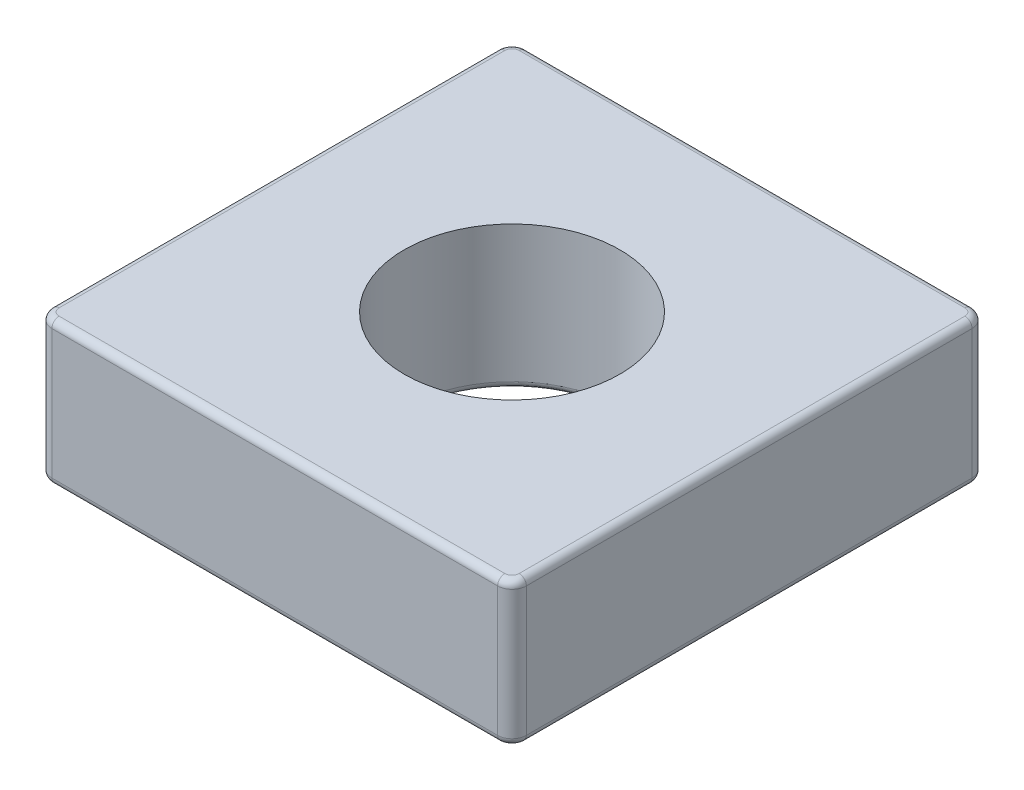
ISO-10303-21;
HEADER;
FILE_DESCRIPTION(('STEP AP214'),'2;1');
FILE_NAME('part.step','',(''),(''),'','','');
FILE_SCHEMA(('AUTOMOTIVE_DESIGN { 1 0 10303 214 1 1 1 1 }'));
ENDSEC;
DATA;
#1=APPLICATION_CONTEXT('core data for automotive mechanical design processes');
#2=APPLICATION_PROTOCOL_DEFINITION('international standard','automotive_design',2000,#1);
#3=PRODUCT_CONTEXT('',#1,'mechanical');
#4=PRODUCT('Part','Part','',(#3));
#5=PRODUCT_RELATED_PRODUCT_CATEGORY('part','',(#4));
#6=PRODUCT_DEFINITION_FORMATION('','',#4);
#7=PRODUCT_DEFINITION_CONTEXT('part definition',#1,'design');
#8=PRODUCT_DEFINITION('design','',#6,#7);
#9=PRODUCT_DEFINITION_SHAPE('','',#8);
#10=(LENGTH_UNIT() NAMED_UNIT(*) SI_UNIT(.MILLI.,.METRE.));
#11=(NAMED_UNIT(*) PLANE_ANGLE_UNIT() SI_UNIT($,.RADIAN.));
#12=(NAMED_UNIT(*) SI_UNIT($,.STERADIAN.) SOLID_ANGLE_UNIT());
#13=UNCERTAINTY_MEASURE_WITH_UNIT(LENGTH_MEASURE(1.E-05),#10,'distance_accuracy_value','');
#14=(GEOMETRIC_REPRESENTATION_CONTEXT(3) GLOBAL_UNCERTAINTY_ASSIGNED_CONTEXT((#13)) GLOBAL_UNIT_ASSIGNED_CONTEXT((#10,
#11,#12)) REPRESENTATION_CONTEXT('',''));
#15=CARTESIAN_POINT('',(0.,0.,0.));
#16=DIRECTION('',(0.,0.,1.));
#17=DIRECTION('',(1.,0.,0.));
#18=AXIS2_PLACEMENT_3D('',#15,#16,#17);
#19=CARTESIAN_POINT('',(-3.3,2.,-3.3));
#20=DIRECTION('',(1.,0.,0.));
#21=DIRECTION('',(0.,0.,-1.));
#22=AXIS2_PLACEMENT_3D('',#19,#20,#21);
#23=PLANE('',#22);
#24=DIRECTION('',(0.,-1.,0.));
#25=VECTOR('',#24,1.);
#26=CARTESIAN_POINT('',(-3.3,2.,3.1));
#27=LINE('',#26,#25);
#28=CARTESIAN_POINT('',(-3.3,0.1,3.1));
#29=VERTEX_POINT('',#28);
#30=CARTESIAN_POINT('',(-3.3,1.9,3.1));
#31=VERTEX_POINT('',#30);
#32=EDGE_CURVE('E303',#29,#31,#27,.F.);
#33=ORIENTED_EDGE('',*,*,#32,.T.);
#34=DIRECTION('',(0.,0.,1.));
#35=VECTOR('',#34,1.);
#36=CARTESIAN_POINT('',(-3.3,1.9,-3.1));
#37=LINE('',#36,#35);
#38=CARTESIAN_POINT('',(-3.3,1.9,-3.1));
#39=VERTEX_POINT('',#38);
#40=EDGE_CURVE('E191',#31,#39,#37,.F.);
#41=ORIENTED_EDGE('',*,*,#40,.T.);
#42=DIRECTION('',(0.,-1.,0.));
#43=VECTOR('',#42,1.);
#44=CARTESIAN_POINT('',(-3.3,2.,-3.1));
#45=LINE('',#44,#43);
#46=CARTESIAN_POINT('',(-3.3,0.1,-3.1));
#47=VERTEX_POINT('',#46);
#48=EDGE_CURVE('E298',#39,#47,#45,.T.);
#49=ORIENTED_EDGE('',*,*,#48,.T.);
#50=DIRECTION('',(0.,0.,1.));
#51=VECTOR('',#50,1.);
#52=CARTESIAN_POINT('',(-3.3,0.1,-3.3));
#53=LINE('',#52,#51);
#54=EDGE_CURVE('E189',#47,#29,#53,.T.);
#55=ORIENTED_EDGE('',*,*,#54,.T.);
#56=EDGE_LOOP('',(#33,#41,#49,#55));
#57=FACE_BOUND('',#56,.T.);
#58=ADVANCED_FACE('F38',(#57),#23,.F.);
#59=CARTESIAN_POINT('',(-3.3,2.,3.3));
#60=DIRECTION('',(0.,0.,-1.));
#61=DIRECTION('',(-1.,0.,0.));
#62=AXIS2_PLACEMENT_3D('',#59,#60,#61);
#63=PLANE('',#62);
#64=DIRECTION('',(0.,-1.,0.));
#65=VECTOR('',#64,1.);
#66=CARTESIAN_POINT('',(-3.1,2.,3.3));
#67=LINE('',#66,#65);
#68=CARTESIAN_POINT('',(-3.1,1.9,3.3));
#69=VERTEX_POINT('',#68);
#70=CARTESIAN_POINT('',(-3.1,0.1,3.3));
#71=VERTEX_POINT('',#70);
#72=EDGE_CURVE('E310',#69,#71,#67,.T.);
#73=ORIENTED_EDGE('',*,*,#72,.T.);
#74=DIRECTION('',(1.,0.,0.));
#75=VECTOR('',#74,1.);
#76=CARTESIAN_POINT('',(-3.3,0.1,3.3));
#77=LINE('',#76,#75);
#78=CARTESIAN_POINT('',(3.1,0.1,3.3));
#79=VERTEX_POINT('',#78);
#80=EDGE_CURVE('E47',#71,#79,#77,.T.);
#81=ORIENTED_EDGE('',*,*,#80,.T.);
#82=DIRECTION('',(0.,-1.,0.));
#83=VECTOR('',#82,1.);
#84=CARTESIAN_POINT('',(3.1,2.,3.3));
#85=LINE('',#84,#83);
#86=CARTESIAN_POINT('',(3.1,1.9,3.3));
#87=VERTEX_POINT('',#86);
#88=EDGE_CURVE('E173',#79,#87,#85,.F.);
#89=ORIENTED_EDGE('',*,*,#88,.T.);
#90=DIRECTION('',(1.,0.,0.));
#91=VECTOR('',#90,1.);
#92=CARTESIAN_POINT('',(-3.1,1.9,3.3));
#93=LINE('',#92,#91);
#94=EDGE_CURVE('E230',#87,#69,#93,.F.);
#95=ORIENTED_EDGE('',*,*,#94,.T.);
#96=EDGE_LOOP('',(#73,#81,#89,#95));
#97=FACE_BOUND('',#96,.T.);
#98=ADVANCED_FACE('F357',(#97),#63,.F.);
#99=CARTESIAN_POINT('',(3.3,2.,-3.3));
#100=DIRECTION('',(-1.,0.,0.));
#101=DIRECTION('',(0.,0.,1.));
#102=AXIS2_PLACEMENT_3D('',#99,#100,#101);
#103=PLANE('',#102);
#104=DIRECTION('',(0.,-1.,0.));
#105=VECTOR('',#104,1.);
#106=CARTESIAN_POINT('',(3.3,2.,-3.1));
#107=LINE('',#106,#105);
#108=CARTESIAN_POINT('',(3.3,0.1,-3.1));
#109=VERTEX_POINT('',#108);
#110=CARTESIAN_POINT('',(3.3,1.9,-3.1));
#111=VERTEX_POINT('',#110);
#112=EDGE_CURVE('E291',#109,#111,#107,.F.);
#113=ORIENTED_EDGE('',*,*,#112,.T.);
#114=DIRECTION('',(0.,0.,-1.));
#115=VECTOR('',#114,1.);
#116=CARTESIAN_POINT('',(3.3,1.9,3.1));
#117=LINE('',#116,#115);
#118=CARTESIAN_POINT('',(3.3,1.9,3.1));
#119=VERTEX_POINT('',#118);
#120=EDGE_CURVE('E207',#111,#119,#117,.F.);
#121=ORIENTED_EDGE('',*,*,#120,.T.);
#122=DIRECTION('',(0.,-1.,0.));
#123=VECTOR('',#122,1.);
#124=CARTESIAN_POINT('',(3.3,2.,3.1));
#125=LINE('',#124,#123);
#126=CARTESIAN_POINT('',(3.3,0.1,3.1));
#127=VERTEX_POINT('',#126);
#128=EDGE_CURVE('E300',#119,#127,#125,.T.);
#129=ORIENTED_EDGE('',*,*,#128,.T.);
#130=DIRECTION('',(0.,0.,-1.));
#131=VECTOR('',#130,1.);
#132=CARTESIAN_POINT('',(3.3,0.1,-3.3));
#133=LINE('',#132,#131);
#134=EDGE_CURVE('E205',#127,#109,#133,.T.);
#135=ORIENTED_EDGE('',*,*,#134,.T.);
#136=EDGE_LOOP('',(#113,#121,#129,#135));
#137=FACE_BOUND('',#136,.T.);
#138=ADVANCED_FACE('F353',(#137),#103,.F.);
#139=CARTESIAN_POINT('',(-3.3,2.,-3.3));
#140=DIRECTION('',(0.,0.,1.));
#141=DIRECTION('',(1.,0.,0.));
#142=AXIS2_PLACEMENT_3D('',#139,#140,#141);
#143=PLANE('',#142);
#144=DIRECTION('',(0.,-1.,0.));
#145=VECTOR('',#144,1.);
#146=CARTESIAN_POINT('',(-3.1,2.,-3.3));
#147=LINE('',#146,#145);
#148=CARTESIAN_POINT('',(-3.1,0.1,-3.3));
#149=VERTEX_POINT('',#148);
#150=CARTESIAN_POINT('',(-3.1,1.9,-3.3));
#151=VERTEX_POINT('',#150);
#152=EDGE_CURVE('E297',#149,#151,#147,.F.);
#153=ORIENTED_EDGE('',*,*,#152,.T.);
#154=DIRECTION('',(-1.,0.,0.));
#155=VECTOR('',#154,1.);
#156=CARTESIAN_POINT('',(3.1,1.9,-3.3));
#157=LINE('',#156,#155);
#158=CARTESIAN_POINT('',(3.1,1.9,-3.3));
#159=VERTEX_POINT('',#158);
#160=EDGE_CURVE('E199',#151,#159,#157,.F.);
#161=ORIENTED_EDGE('',*,*,#160,.T.);
#162=DIRECTION('',(0.,-1.,0.));
#163=VECTOR('',#162,1.);
#164=CARTESIAN_POINT('',(3.1,2.,-3.3));
#165=LINE('',#164,#163);
#166=CARTESIAN_POINT('',(3.1,0.1,-3.3));
#167=VERTEX_POINT('',#166);
#168=EDGE_CURVE('E288',#159,#167,#165,.T.);
#169=ORIENTED_EDGE('',*,*,#168,.T.);
#170=DIRECTION('',(-1.,0.,0.));
#171=VECTOR('',#170,1.);
#172=CARTESIAN_POINT('',(-3.3,0.1,-3.3));
#173=LINE('',#172,#171);
#174=EDGE_CURVE('E197',#167,#149,#173,.T.);
#175=ORIENTED_EDGE('',*,*,#174,.T.);
#176=EDGE_LOOP('',(#153,#161,#169,#175));
#177=FACE_BOUND('',#176,.T.);
#178=ADVANCED_FACE('F294',(#177),#143,.F.);
#179=CARTESIAN_POINT('',(0.,2.,0.));
#180=DIRECTION('',(0.,1.,0.));
#181=DIRECTION('',(0.,0.,1.));
#182=AXIS2_PLACEMENT_3D('',#179,#180,#181);
#183=PLANE('',#182);
#184=DIRECTION('',(0.,0.,1.));
#185=VECTOR('',#184,1.);
#186=CARTESIAN_POINT('',(-3.2,2.,3.1));
#187=LINE('',#186,#185);
#188=CARTESIAN_POINT('',(-3.2,2.,-3.1));
#189=VERTEX_POINT('',#188);
#190=CARTESIAN_POINT('',(-3.2,2.,3.1));
#191=VERTEX_POINT('',#190);
#192=EDGE_CURVE('E178',#189,#191,#187,.T.);
#193=ORIENTED_EDGE('',*,*,#192,.T.);
#194=CARTESIAN_POINT('',(-3.1,2.,3.1));
#195=DIRECTION('',(0.,1.,0.));
#196=DIRECTION('',(0.,0.,1.));
#197=AXIS2_PLACEMENT_3D('',#194,#195,#196);
#198=CIRCLE('',#197,0.1);
#199=CARTESIAN_POINT('',(-3.1,2.,3.2));
#200=VERTEX_POINT('',#199);
#201=EDGE_CURVE('E158',#191,#200,#198,.T.);
#202=ORIENTED_EDGE('',*,*,#201,.T.);
#203=DIRECTION('',(1.,0.,0.));
#204=VECTOR('',#203,1.);
#205=CARTESIAN_POINT('',(3.1,2.,3.2));
#206=LINE('',#205,#204);
#207=CARTESIAN_POINT('',(3.1,2.,3.2));
#208=VERTEX_POINT('',#207);
#209=EDGE_CURVE('E166',#200,#208,#206,.T.);
#210=ORIENTED_EDGE('',*,*,#209,.T.);
#211=CARTESIAN_POINT('',(3.1,2.,3.1));
#212=DIRECTION('',(0.,1.,0.));
#213=DIRECTION('',(0.,0.,1.));
#214=AXIS2_PLACEMENT_3D('',#211,#212,#213);
#215=CIRCLE('',#214,0.1);
#216=CARTESIAN_POINT('',(3.2,2.,3.1));
#217=VERTEX_POINT('',#216);
#218=EDGE_CURVE('E172',#208,#217,#215,.T.);
#219=ORIENTED_EDGE('',*,*,#218,.T.);
#220=DIRECTION('',(0.,0.,-1.));
#221=VECTOR('',#220,1.);
#222=CARTESIAN_POINT('',(3.2,2.,-3.1));
#223=LINE('',#222,#221);
#224=CARTESIAN_POINT('',(3.2,2.,-3.1));
#225=VERTEX_POINT('',#224);
#226=EDGE_CURVE('E316',#217,#225,#223,.T.);
#227=ORIENTED_EDGE('',*,*,#226,.T.);
#228=CARTESIAN_POINT('',(3.1,2.,-3.1));
#229=DIRECTION('',(0.,1.,0.));
#230=DIRECTION('',(0.,0.,1.));
#231=AXIS2_PLACEMENT_3D('',#228,#229,#230);
#232=CIRCLE('',#231,0.1);
#233=CARTESIAN_POINT('',(3.1,2.,-3.2));
#234=VERTEX_POINT('',#233);
#235=EDGE_CURVE('E318',#225,#234,#232,.T.);
#236=ORIENTED_EDGE('',*,*,#235,.T.);
#237=DIRECTION('',(-1.,0.,0.));
#238=VECTOR('',#237,1.);
#239=CARTESIAN_POINT('',(-3.1,2.,-3.2));
#240=LINE('',#239,#238);
#241=CARTESIAN_POINT('',(-3.1,2.,-3.2));
#242=VERTEX_POINT('',#241);
#243=EDGE_CURVE('E320',#234,#242,#240,.T.);
#244=ORIENTED_EDGE('',*,*,#243,.T.);
#245=CARTESIAN_POINT('',(-3.1,2.,-3.1));
#246=DIRECTION('',(0.,1.,0.));
#247=DIRECTION('',(0.,0.,1.));
#248=AXIS2_PLACEMENT_3D('',#245,#246,#247);
#249=CIRCLE('',#248,0.1);
#250=EDGE_CURVE('E184',#242,#189,#249,.T.);
#251=ORIENTED_EDGE('',*,*,#250,.T.);
#252=EDGE_LOOP('',(#193,#202,#210,#219,#227,#236,#244,#251));
#253=FACE_BOUND('',#252,.T.);
#254=CARTESIAN_POINT('',(0.,2.,0.));
#255=DIRECTION('',(0.,1.,0.));
#256=DIRECTION('',(0.,0.,1.));
#257=AXIS2_PLACEMENT_3D('',#254,#255,#256);
#258=CIRCLE('',#257,1.5);
#259=CARTESIAN_POINT('',(0.,2.,1.5));
#260=VERTEX_POINT('',#259);
#261=EDGE_CURVE('E250',#260,#260,#258,.T.);
#262=ORIENTED_EDGE('',*,*,#261,.F.);
#263=EDGE_LOOP('',(#262));
#264=FACE_BOUND('',#263,.T.);
#265=ADVANCED_FACE('F175',(#253,#264),#183,.T.);
#266=CARTESIAN_POINT('',(0.,0.,0.));
#267=DIRECTION('',(0.,1.,0.));
#268=DIRECTION('',(0.,0.,1.));
#269=AXIS2_PLACEMENT_3D('',#266,#267,#268);
#270=PLANE('',#269);
#271=DIRECTION('',(1.,0.,0.));
#272=VECTOR('',#271,1.);
#273=CARTESIAN_POINT('',(0.,0.,3.2));
#274=LINE('',#273,#272);
#275=CARTESIAN_POINT('',(3.1,0.,3.2));
#276=VERTEX_POINT('',#275);
#277=CARTESIAN_POINT('',(-3.1,0.,3.2));
#278=VERTEX_POINT('',#277);
#279=EDGE_CURVE('E55',#276,#278,#274,.F.);
#280=ORIENTED_EDGE('',*,*,#279,.T.);
#281=CARTESIAN_POINT('',(-3.1,0.,3.1));
#282=DIRECTION('',(0.,1.,0.));
#283=DIRECTION('',(0.,0.,1.));
#284=AXIS2_PLACEMENT_3D('',#281,#282,#283);
#285=CIRCLE('',#284,0.1);
#286=CARTESIAN_POINT('',(-3.2,0.,3.1));
#287=VERTEX_POINT('',#286);
#288=EDGE_CURVE('E228',#278,#287,#285,.F.);
#289=ORIENTED_EDGE('',*,*,#288,.T.);
#290=DIRECTION('',(0.,0.,1.));
#291=VECTOR('',#290,1.);
#292=CARTESIAN_POINT('',(-3.2,0.,0.));
#293=LINE('',#292,#291);
#294=CARTESIAN_POINT('',(-3.2,0.,-3.1));
#295=VERTEX_POINT('',#294);
#296=EDGE_CURVE('E216',#287,#295,#293,.F.);
#297=ORIENTED_EDGE('',*,*,#296,.T.);
#298=CARTESIAN_POINT('',(-3.1,0.,-3.1));
#299=DIRECTION('',(0.,1.,0.));
#300=DIRECTION('',(0.,0.,1.));
#301=AXIS2_PLACEMENT_3D('',#298,#299,#300);
#302=CIRCLE('',#301,0.1);
#303=CARTESIAN_POINT('',(-3.1,0.,-3.2));
#304=VERTEX_POINT('',#303);
#305=EDGE_CURVE('E218',#295,#304,#302,.F.);
#306=ORIENTED_EDGE('',*,*,#305,.T.);
#307=DIRECTION('',(-1.,0.,0.));
#308=VECTOR('',#307,1.);
#309=CARTESIAN_POINT('',(0.,0.,-3.2));
#310=LINE('',#309,#308);
#311=CARTESIAN_POINT('',(3.1,0.,-3.2));
#312=VERTEX_POINT('',#311);
#313=EDGE_CURVE('E220',#304,#312,#310,.F.);
#314=ORIENTED_EDGE('',*,*,#313,.T.);
#315=CARTESIAN_POINT('',(3.1,0.,-3.1));
#316=DIRECTION('',(0.,1.,0.));
#317=DIRECTION('',(0.,0.,1.));
#318=AXIS2_PLACEMENT_3D('',#315,#316,#317);
#319=CIRCLE('',#318,0.1);
#320=CARTESIAN_POINT('',(3.2,0.,-3.1));
#321=VERTEX_POINT('',#320);
#322=EDGE_CURVE('E222',#312,#321,#319,.F.);
#323=ORIENTED_EDGE('',*,*,#322,.T.);
#324=DIRECTION('',(0.,0.,-1.));
#325=VECTOR('',#324,1.);
#326=CARTESIAN_POINT('',(3.2,0.,0.));
#327=LINE('',#326,#325);
#328=CARTESIAN_POINT('',(3.2,0.,3.1));
#329=VERTEX_POINT('',#328);
#330=EDGE_CURVE('E224',#321,#329,#327,.F.);
#331=ORIENTED_EDGE('',*,*,#330,.T.);
#332=CARTESIAN_POINT('',(3.1,0.,3.1));
#333=DIRECTION('',(0.,1.,0.));
#334=DIRECTION('',(0.,0.,1.));
#335=AXIS2_PLACEMENT_3D('',#332,#333,#334);
#336=CIRCLE('',#335,0.1);
#337=EDGE_CURVE('E60',#329,#276,#336,.F.);
#338=ORIENTED_EDGE('',*,*,#337,.T.);
#339=EDGE_LOOP('',(#280,#289,#297,#306,#314,#323,#331,#338));
#340=FACE_BOUND('',#339,.T.);
#341=CARTESIAN_POINT('',(0.,0.,0.));
#342=DIRECTION('',(0.,1.,0.));
#343=DIRECTION('',(0.,0.,1.));
#344=AXIS2_PLACEMENT_3D('',#341,#342,#343);
#345=CIRCLE('',#344,1.6);
#346=CARTESIAN_POINT('',(0.,0.,1.6));
#347=VERTEX_POINT('',#346);
#348=EDGE_CURVE('E213',#347,#347,#345,.T.);
#349=ORIENTED_EDGE('',*,*,#348,.T.);
#350=EDGE_LOOP('',(#349));
#351=FACE_BOUND('',#350,.T.);
#352=ADVANCED_FACE('F346',(#340,#351),#270,.F.);
#353=CARTESIAN_POINT('',(0.,0.,0.));
#354=DIRECTION('',(0.,1.,0.));
#355=DIRECTION('',(0.,0.,1.));
#356=AXIS2_PLACEMENT_3D('',#353,#354,#355);
#357=CYLINDRICAL_SURFACE('',#356,1.5);
#358=CARTESIAN_POINT('',(0.,0.1,0.));
#359=DIRECTION('',(0.,1.,0.));
#360=DIRECTION('',(0.,0.,1.));
#361=AXIS2_PLACEMENT_3D('',#358,#359,#360);
#362=CIRCLE('',#361,1.5);
#363=CARTESIAN_POINT('',(0.,0.1,1.5));
#364=VERTEX_POINT('',#363);
#365=EDGE_CURVE('E11',#364,#364,#362,.F.);
#366=ORIENTED_EDGE('',*,*,#365,.T.);
#367=EDGE_LOOP('',(#366));
#368=FACE_BOUND('',#367,.T.);
#369=ORIENTED_EDGE('',*,*,#261,.T.);
#370=EDGE_LOOP('',(#369));
#371=FACE_BOUND('',#370,.T.);
#372=ADVANCED_FACE('F344',(#368,#371),#357,.F.);
#373=CARTESIAN_POINT('',(-3.1,2.,-3.1));
#374=DIRECTION('',(0.,-1.,0.));
#375=DIRECTION('',(0.,0.,-1.));
#376=AXIS2_PLACEMENT_3D('',#373,#374,#375);
#377=CYLINDRICAL_SURFACE('',#376,0.2);
#378=ORIENTED_EDGE('',*,*,#48,.F.);
#379=CARTESIAN_POINT('',(-3.1,1.9,-3.1));
#380=DIRECTION('',(0.,1.,0.));
#381=DIRECTION('',(0.,0.,1.));
#382=AXIS2_PLACEMENT_3D('',#379,#380,#381);
#383=CIRCLE('',#382,0.2);
#384=EDGE_CURVE('E195',#39,#151,#383,.F.);
#385=ORIENTED_EDGE('',*,*,#384,.T.);
#386=ORIENTED_EDGE('',*,*,#152,.F.);
#387=CARTESIAN_POINT('',(-3.1,0.1,-3.1));
#388=DIRECTION('',(0.,1.,0.));
#389=DIRECTION('',(0.,0.,1.));
#390=AXIS2_PLACEMENT_3D('',#387,#388,#389);
#391=CIRCLE('',#390,0.2);
#392=EDGE_CURVE('E193',#149,#47,#391,.T.);
#393=ORIENTED_EDGE('',*,*,#392,.T.);
#394=EDGE_LOOP('',(#378,#385,#386,#393));
#395=FACE_BOUND('',#394,.T.);
#396=ADVANCED_FACE('F366',(#395),#377,.T.);
#397=CARTESIAN_POINT('',(3.1,2.,-3.1));
#398=DIRECTION('',(0.,-1.,0.));
#399=DIRECTION('',(0.,0.,-1.));
#400=AXIS2_PLACEMENT_3D('',#397,#398,#399);
#401=CYLINDRICAL_SURFACE('',#400,0.2);
#402=ORIENTED_EDGE('',*,*,#168,.F.);
#403=CARTESIAN_POINT('',(3.1,1.9,-3.1));
#404=DIRECTION('',(0.,1.,0.));
#405=DIRECTION('',(0.,0.,1.));
#406=AXIS2_PLACEMENT_3D('',#403,#404,#405);
#407=CIRCLE('',#406,0.2);
#408=EDGE_CURVE('E203',#159,#111,#407,.F.);
#409=ORIENTED_EDGE('',*,*,#408,.T.);
#410=ORIENTED_EDGE('',*,*,#112,.F.);
#411=CARTESIAN_POINT('',(3.1,0.1,-3.1));
#412=DIRECTION('',(0.,1.,0.));
#413=DIRECTION('',(0.,0.,1.));
#414=AXIS2_PLACEMENT_3D('',#411,#412,#413);
#415=CIRCLE('',#414,0.2);
#416=EDGE_CURVE('E201',#109,#167,#415,.T.);
#417=ORIENTED_EDGE('',*,*,#416,.T.);
#418=EDGE_LOOP('',(#402,#409,#410,#417));
#419=FACE_BOUND('',#418,.T.);
#420=ADVANCED_FACE('F287',(#419),#401,.T.);
#421=CARTESIAN_POINT('',(3.1,2.,3.1));
#422=DIRECTION('',(0.,-1.,0.));
#423=DIRECTION('',(0.,0.,-1.));
#424=AXIS2_PLACEMENT_3D('',#421,#422,#423);
#425=CYLINDRICAL_SURFACE('',#424,0.2);
#426=ORIENTED_EDGE('',*,*,#128,.F.);
#427=CARTESIAN_POINT('',(3.1,1.9,3.1));
#428=DIRECTION('',(0.,1.,0.));
#429=DIRECTION('',(0.,0.,1.));
#430=AXIS2_PLACEMENT_3D('',#427,#428,#429);
#431=CIRCLE('',#430,0.2);
#432=EDGE_CURVE('E211',#119,#87,#431,.F.);
#433=ORIENTED_EDGE('',*,*,#432,.T.);
#434=ORIENTED_EDGE('',*,*,#88,.F.);
#435=CARTESIAN_POINT('',(3.1,0.1,3.1));
#436=DIRECTION('',(0.,1.,0.));
#437=DIRECTION('',(0.,0.,1.));
#438=AXIS2_PLACEMENT_3D('',#435,#436,#437);
#439=CIRCLE('',#438,0.2);
#440=EDGE_CURVE('E209',#79,#127,#439,.T.);
#441=ORIENTED_EDGE('',*,*,#440,.T.);
#442=EDGE_LOOP('',(#426,#433,#434,#441));
#443=FACE_BOUND('',#442,.T.);
#444=ADVANCED_FACE('F372',(#443),#425,.T.);
#445=CARTESIAN_POINT('',(-3.1,2.,3.1));
#446=DIRECTION('',(0.,-1.,0.));
#447=DIRECTION('',(0.,0.,-1.));
#448=AXIS2_PLACEMENT_3D('',#445,#446,#447);
#449=CYLINDRICAL_SURFACE('',#448,0.2);
#450=ORIENTED_EDGE('',*,*,#72,.F.);
#451=CARTESIAN_POINT('',(-3.1,1.9,3.1));
#452=DIRECTION('',(0.,1.,0.));
#453=DIRECTION('',(0.,0.,1.));
#454=AXIS2_PLACEMENT_3D('',#451,#452,#453);
#455=CIRCLE('',#454,0.2);
#456=EDGE_CURVE('E160',#69,#31,#455,.F.);
#457=ORIENTED_EDGE('',*,*,#456,.T.);
#458=ORIENTED_EDGE('',*,*,#32,.F.);
#459=CARTESIAN_POINT('',(-3.1,0.1,3.1));
#460=DIRECTION('',(0.,1.,0.));
#461=DIRECTION('',(0.,0.,1.));
#462=AXIS2_PLACEMENT_3D('',#459,#460,#461);
#463=CIRCLE('',#462,0.2);
#464=EDGE_CURVE('E180',#29,#71,#463,.T.);
#465=ORIENTED_EDGE('',*,*,#464,.T.);
#466=EDGE_LOOP('',(#450,#457,#458,#465));
#467=FACE_BOUND('',#466,.T.);
#468=ADVANCED_FACE('F337',(#467),#449,.T.);
#469=CARTESIAN_POINT('',(3.1,1.9,-3.1));
#470=DIRECTION('',(0.,1.,0.));
#471=DIRECTION('',(0.,0.,1.));
#472=AXIS2_PLACEMENT_3D('',#469,#470,#471);
#473=DEGENERATE_TOROIDAL_SURFACE('',#472,0.1,0.1,.T.);
#474=CARTESIAN_POINT('',(3.2,1.9,-3.1));
#475=DIRECTION('',(0.,0.,1.));
#476=DIRECTION('',(1.,0.,0.));
#477=AXIS2_PLACEMENT_3D('',#474,#475,#476);
#478=CIRCLE('',#477,0.1);
#479=EDGE_CURVE('E244',#111,#225,#478,.T.);
#480=ORIENTED_EDGE('',*,*,#479,.F.);
#481=ORIENTED_EDGE('',*,*,#408,.F.);
#482=CARTESIAN_POINT('',(3.1,1.9,-3.2));
#483=DIRECTION('',(-1.,0.,0.));
#484=DIRECTION('',(0.,0.,1.));
#485=AXIS2_PLACEMENT_3D('',#482,#483,#484);
#486=CIRCLE('',#485,0.1);
#487=EDGE_CURVE('E247',#234,#159,#486,.T.);
#488=ORIENTED_EDGE('',*,*,#487,.F.);
#489=ORIENTED_EDGE('',*,*,#235,.F.);
#490=EDGE_LOOP('',(#480,#481,#488,#489));
#491=FACE_BOUND('',#490,.T.);
#492=ADVANCED_FACE('F378',(#491),#473,.T.);
#493=CARTESIAN_POINT('',(0.,1.9,-3.2));
#494=DIRECTION('',(1.,0.,0.));
#495=DIRECTION('',(0.,0.,-1.));
#496=AXIS2_PLACEMENT_3D('',#493,#494,#495);
#497=CYLINDRICAL_SURFACE('',#496,0.1);
#498=ORIENTED_EDGE('',*,*,#487,.T.);
#499=ORIENTED_EDGE('',*,*,#160,.F.);
#500=CARTESIAN_POINT('',(-3.1,1.9,-3.2));
#501=DIRECTION('',(-1.,0.,0.));
#502=DIRECTION('',(0.,0.,1.));
#503=AXIS2_PLACEMENT_3D('',#500,#501,#502);
#504=CIRCLE('',#503,0.1);
#505=EDGE_CURVE('E241',#242,#151,#504,.T.);
#506=ORIENTED_EDGE('',*,*,#505,.F.);
#507=ORIENTED_EDGE('',*,*,#243,.F.);
#508=EDGE_LOOP('',(#498,#499,#506,#507));
#509=FACE_BOUND('',#508,.T.);
#510=ADVANCED_FACE('F394',(#509),#497,.T.);
#511=CARTESIAN_POINT('',(3.2,1.9,0.));
#512=DIRECTION('',(0.,0.,1.));
#513=DIRECTION('',(1.,0.,0.));
#514=AXIS2_PLACEMENT_3D('',#511,#512,#513);
#515=CYLINDRICAL_SURFACE('',#514,0.1);
#516=ORIENTED_EDGE('',*,*,#479,.T.);
#517=ORIENTED_EDGE('',*,*,#226,.F.);
#518=CARTESIAN_POINT('',(3.2,1.9,3.1));
#519=DIRECTION('',(0.,0.,1.));
#520=DIRECTION('',(1.,0.,0.));
#521=AXIS2_PLACEMENT_3D('',#518,#519,#520);
#522=CIRCLE('',#521,0.1);
#523=EDGE_CURVE('E238',#119,#217,#522,.T.);
#524=ORIENTED_EDGE('',*,*,#523,.F.);
#525=ORIENTED_EDGE('',*,*,#120,.F.);
#526=EDGE_LOOP('',(#516,#517,#524,#525));
#527=FACE_BOUND('',#526,.T.);
#528=ADVANCED_FACE('F391',(#527),#515,.T.);
#529=CARTESIAN_POINT('',(-3.1,1.9,-3.1));
#530=DIRECTION('',(0.,1.,0.));
#531=DIRECTION('',(0.,0.,1.));
#532=AXIS2_PLACEMENT_3D('',#529,#530,#531);
#533=DEGENERATE_TOROIDAL_SURFACE('',#532,0.1,0.1,.T.);
#534=ORIENTED_EDGE('',*,*,#505,.T.);
#535=ORIENTED_EDGE('',*,*,#384,.F.);
#536=CARTESIAN_POINT('',(-3.2,1.9,-3.1));
#537=DIRECTION('',(0.,0.,1.));
#538=DIRECTION('',(1.,0.,0.));
#539=AXIS2_PLACEMENT_3D('',#536,#537,#538);
#540=CIRCLE('',#539,0.1);
#541=EDGE_CURVE('E235',#189,#39,#540,.T.);
#542=ORIENTED_EDGE('',*,*,#541,.F.);
#543=ORIENTED_EDGE('',*,*,#250,.F.);
#544=EDGE_LOOP('',(#534,#535,#542,#543));
#545=FACE_BOUND('',#544,.T.);
#546=ADVANCED_FACE('F327',(#545),#533,.T.);
#547=CARTESIAN_POINT('',(3.1,1.9,3.1));
#548=DIRECTION('',(0.,1.,0.));
#549=DIRECTION('',(0.,0.,1.));
#550=AXIS2_PLACEMENT_3D('',#547,#548,#549);
#551=DEGENERATE_TOROIDAL_SURFACE('',#550,0.1,0.1,.T.);
#552=ORIENTED_EDGE('',*,*,#523,.T.);
#553=ORIENTED_EDGE('',*,*,#218,.F.);
#554=CARTESIAN_POINT('',(3.1,1.9,3.2));
#555=DIRECTION('',(-1.,0.,0.));
#556=DIRECTION('',(0.,-1.,0.));
#557=AXIS2_PLACEMENT_3D('',#554,#555,#556);
#558=CIRCLE('',#557,0.1);
#559=EDGE_CURVE('E169',#87,#208,#558,.T.);
#560=ORIENTED_EDGE('',*,*,#559,.F.);
#561=ORIENTED_EDGE('',*,*,#432,.F.);
#562=EDGE_LOOP('',(#552,#553,#560,#561));
#563=FACE_BOUND('',#562,.T.);
#564=ADVANCED_FACE('F385',(#563),#551,.T.);
#565=CARTESIAN_POINT('',(-3.2,1.9,0.));
#566=DIRECTION('',(0.,0.,-1.));
#567=DIRECTION('',(-1.,0.,0.));
#568=AXIS2_PLACEMENT_3D('',#565,#566,#567);
#569=CYLINDRICAL_SURFACE('',#568,0.1);
#570=ORIENTED_EDGE('',*,*,#541,.T.);
#571=ORIENTED_EDGE('',*,*,#40,.F.);
#572=CARTESIAN_POINT('',(-3.2,1.9,3.1));
#573=DIRECTION('',(0.,0.,1.));
#574=DIRECTION('',(1.,0.,0.));
#575=AXIS2_PLACEMENT_3D('',#572,#573,#574);
#576=CIRCLE('',#575,0.1);
#577=EDGE_CURVE('E163',#191,#31,#576,.T.);
#578=ORIENTED_EDGE('',*,*,#577,.F.);
#579=ORIENTED_EDGE('',*,*,#192,.F.);
#580=EDGE_LOOP('',(#570,#571,#578,#579));
#581=FACE_BOUND('',#580,.T.);
#582=ADVANCED_FACE('F330',(#581),#569,.T.);
#583=CARTESIAN_POINT('',(0.,1.9,3.2));
#584=DIRECTION('',(-1.,0.,0.));
#585=DIRECTION('',(0.,0.,1.));
#586=AXIS2_PLACEMENT_3D('',#583,#584,#585);
#587=CYLINDRICAL_SURFACE('',#586,0.1);
#588=ORIENTED_EDGE('',*,*,#559,.T.);
#589=ORIENTED_EDGE('',*,*,#209,.F.);
#590=CARTESIAN_POINT('',(-3.1,1.9,3.2));
#591=DIRECTION('',(-1.,0.,0.));
#592=DIRECTION('',(0.,0.,1.));
#593=AXIS2_PLACEMENT_3D('',#590,#591,#592);
#594=CIRCLE('',#593,0.1);
#595=EDGE_CURVE('E154',#69,#200,#594,.T.);
#596=ORIENTED_EDGE('',*,*,#595,.F.);
#597=ORIENTED_EDGE('',*,*,#94,.F.);
#598=EDGE_LOOP('',(#588,#589,#596,#597));
#599=FACE_BOUND('',#598,.T.);
#600=ADVANCED_FACE('F167',(#599),#587,.T.);
#601=CARTESIAN_POINT('',(-3.1,1.9,3.1));
#602=DIRECTION('',(0.,1.,0.));
#603=DIRECTION('',(0.,0.,1.));
#604=AXIS2_PLACEMENT_3D('',#601,#602,#603);
#605=DEGENERATE_TOROIDAL_SURFACE('',#604,0.1,0.1,.T.);
#606=ORIENTED_EDGE('',*,*,#577,.T.);
#607=ORIENTED_EDGE('',*,*,#456,.F.);
#608=ORIENTED_EDGE('',*,*,#595,.T.);
#609=ORIENTED_EDGE('',*,*,#201,.F.);
#610=EDGE_LOOP('',(#606,#607,#608,#609));
#611=FACE_BOUND('',#610,.T.);
#612=ADVANCED_FACE('F156',(#611),#605,.T.);
#613=CARTESIAN_POINT('',(3.1,0.1,-3.1));
#614=DIRECTION('',(0.,1.,0.));
#615=DIRECTION('',(0.,0.,1.));
#616=AXIS2_PLACEMENT_3D('',#613,#614,#615);
#617=DEGENERATE_TOROIDAL_SURFACE('',#616,0.1,0.1,.T.);
#618=CARTESIAN_POINT('',(3.1,0.1,-3.2));
#619=DIRECTION('',(-1.,0.,0.));
#620=DIRECTION('',(0.,0.,1.));
#621=AXIS2_PLACEMENT_3D('',#618,#619,#620);
#622=CIRCLE('',#621,0.1);
#623=EDGE_CURVE('E266',#167,#312,#622,.T.);
#624=ORIENTED_EDGE('',*,*,#623,.F.);
#625=ORIENTED_EDGE('',*,*,#416,.F.);
#626=CARTESIAN_POINT('',(3.2,0.1,-3.1));
#627=DIRECTION('',(0.,0.,1.));
#628=DIRECTION('',(1.,0.,0.));
#629=AXIS2_PLACEMENT_3D('',#626,#627,#628);
#630=CIRCLE('',#629,0.1);
#631=EDGE_CURVE('E42',#321,#109,#630,.T.);
#632=ORIENTED_EDGE('',*,*,#631,.F.);
#633=ORIENTED_EDGE('',*,*,#322,.F.);
#634=EDGE_LOOP('',(#624,#625,#632,#633));
#635=FACE_BOUND('',#634,.T.);
#636=ADVANCED_FACE('F282',(#635),#617,.T.);
#637=CARTESIAN_POINT('',(3.2,0.1,-3.3));
#638=DIRECTION('',(0.,0.,-1.));
#639=DIRECTION('',(-1.,0.,0.));
#640=AXIS2_PLACEMENT_3D('',#637,#638,#639);
#641=CYLINDRICAL_SURFACE('',#640,0.1);
#642=ORIENTED_EDGE('',*,*,#631,.T.);
#643=ORIENTED_EDGE('',*,*,#134,.F.);
#644=CARTESIAN_POINT('',(3.2,0.1,3.1));
#645=DIRECTION('',(0.,0.,1.));
#646=DIRECTION('',(1.,0.,0.));
#647=AXIS2_PLACEMENT_3D('',#644,#645,#646);
#648=CIRCLE('',#647,0.1);
#649=EDGE_CURVE('E264',#329,#127,#648,.T.);
#650=ORIENTED_EDGE('',*,*,#649,.F.);
#651=ORIENTED_EDGE('',*,*,#330,.F.);
#652=EDGE_LOOP('',(#642,#643,#650,#651));
#653=FACE_BOUND('',#652,.T.);
#654=ADVANCED_FACE('F277',(#653),#641,.T.);
#655=CARTESIAN_POINT('',(-3.3,0.1,-3.2));
#656=DIRECTION('',(-1.,0.,0.));
#657=DIRECTION('',(0.,0.,1.));
#658=AXIS2_PLACEMENT_3D('',#655,#656,#657);
#659=CYLINDRICAL_SURFACE('',#658,0.1);
#660=ORIENTED_EDGE('',*,*,#623,.T.);
#661=ORIENTED_EDGE('',*,*,#313,.F.);
#662=CARTESIAN_POINT('',(-3.1,0.1,-3.2));
#663=DIRECTION('',(-1.,0.,0.));
#664=DIRECTION('',(0.,0.,1.));
#665=AXIS2_PLACEMENT_3D('',#662,#663,#664);
#666=CIRCLE('',#665,0.1);
#667=EDGE_CURVE('E261',#149,#304,#666,.T.);
#668=ORIENTED_EDGE('',*,*,#667,.F.);
#669=ORIENTED_EDGE('',*,*,#174,.F.);
#670=EDGE_LOOP('',(#660,#661,#668,#669));
#671=FACE_BOUND('',#670,.T.);
#672=ADVANCED_FACE('F421',(#671),#659,.T.);
#673=CARTESIAN_POINT('',(3.1,0.1,3.1));
#674=DIRECTION('',(0.,1.,0.));
#675=DIRECTION('',(0.,0.,1.));
#676=AXIS2_PLACEMENT_3D('',#673,#674,#675);
#677=DEGENERATE_TOROIDAL_SURFACE('',#676,0.1,0.1,.T.);
#678=ORIENTED_EDGE('',*,*,#649,.T.);
#679=ORIENTED_EDGE('',*,*,#440,.F.);
#680=CARTESIAN_POINT('',(3.1,0.1,3.2));
#681=DIRECTION('',(-1.,0.,0.));
#682=DIRECTION('',(0.,0.,1.));
#683=AXIS2_PLACEMENT_3D('',#680,#681,#682);
#684=CIRCLE('',#683,0.1);
#685=EDGE_CURVE('E258',#276,#79,#684,.T.);
#686=ORIENTED_EDGE('',*,*,#685,.F.);
#687=ORIENTED_EDGE('',*,*,#337,.F.);
#688=EDGE_LOOP('',(#678,#679,#686,#687));
#689=FACE_BOUND('',#688,.T.);
#690=ADVANCED_FACE('F417',(#689),#677,.T.);
#691=CARTESIAN_POINT('',(-3.1,0.1,-3.1));
#692=DIRECTION('',(0.,1.,0.));
#693=DIRECTION('',(0.,0.,1.));
#694=AXIS2_PLACEMENT_3D('',#691,#692,#693);
#695=DEGENERATE_TOROIDAL_SURFACE('',#694,0.1,0.1,.T.);
#696=ORIENTED_EDGE('',*,*,#667,.T.);
#697=ORIENTED_EDGE('',*,*,#305,.F.);
#698=CARTESIAN_POINT('',(-3.2,0.1,-3.1));
#699=DIRECTION('',(0.,0.,1.));
#700=DIRECTION('',(1.,0.,0.));
#701=AXIS2_PLACEMENT_3D('',#698,#699,#700);
#702=CIRCLE('',#701,0.1);
#703=EDGE_CURVE('E255',#47,#295,#702,.T.);
#704=ORIENTED_EDGE('',*,*,#703,.F.);
#705=ORIENTED_EDGE('',*,*,#392,.F.);
#706=EDGE_LOOP('',(#696,#697,#704,#705));
#707=FACE_BOUND('',#706,.T.);
#708=ADVANCED_FACE('F413',(#707),#695,.T.);
#709=CARTESIAN_POINT('',(-3.3,0.1,3.2));
#710=DIRECTION('',(1.,0.,0.));
#711=DIRECTION('',(0.,0.,-1.));
#712=AXIS2_PLACEMENT_3D('',#709,#710,#711);
#713=CYLINDRICAL_SURFACE('',#712,0.1);
#714=ORIENTED_EDGE('',*,*,#685,.T.);
#715=ORIENTED_EDGE('',*,*,#80,.F.);
#716=CARTESIAN_POINT('',(-3.1,0.1,3.2));
#717=DIRECTION('',(-1.,0.,0.));
#718=DIRECTION('',(0.,0.,1.));
#719=AXIS2_PLACEMENT_3D('',#716,#717,#718);
#720=CIRCLE('',#719,0.1);
#721=EDGE_CURVE('E253',#278,#71,#720,.T.);
#722=ORIENTED_EDGE('',*,*,#721,.F.);
#723=ORIENTED_EDGE('',*,*,#279,.F.);
#724=EDGE_LOOP('',(#714,#715,#722,#723));
#725=FACE_BOUND('',#724,.T.);
#726=ADVANCED_FACE('F409',(#725),#713,.T.);
#727=CARTESIAN_POINT('',(-3.2,0.1,-3.3));
#728=DIRECTION('',(0.,0.,1.));
#729=DIRECTION('',(1.,0.,0.));
#730=AXIS2_PLACEMENT_3D('',#727,#728,#729);
#731=CYLINDRICAL_SURFACE('',#730,0.1);
#732=ORIENTED_EDGE('',*,*,#703,.T.);
#733=ORIENTED_EDGE('',*,*,#296,.F.);
#734=CARTESIAN_POINT('',(-3.2,0.1,3.1));
#735=DIRECTION('',(0.,0.,1.));
#736=DIRECTION('',(1.,0.,0.));
#737=AXIS2_PLACEMENT_3D('',#734,#735,#736);
#738=CIRCLE('',#737,0.1);
#739=EDGE_CURVE('E251',#29,#287,#738,.T.);
#740=ORIENTED_EDGE('',*,*,#739,.F.);
#741=ORIENTED_EDGE('',*,*,#54,.F.);
#742=EDGE_LOOP('',(#732,#733,#740,#741));
#743=FACE_BOUND('',#742,.T.);
#744=ADVANCED_FACE('F405',(#743),#731,.T.);
#745=CARTESIAN_POINT('',(-3.1,0.1,3.1));
#746=DIRECTION('',(0.,1.,0.));
#747=DIRECTION('',(0.,0.,1.));
#748=AXIS2_PLACEMENT_3D('',#745,#746,#747);
#749=DEGENERATE_TOROIDAL_SURFACE('',#748,0.1,0.1,.T.);
#750=ORIENTED_EDGE('',*,*,#721,.T.);
#751=ORIENTED_EDGE('',*,*,#464,.F.);
#752=ORIENTED_EDGE('',*,*,#739,.T.);
#753=ORIENTED_EDGE('',*,*,#288,.F.);
#754=EDGE_LOOP('',(#750,#751,#752,#753));
#755=FACE_BOUND('',#754,.T.);
#756=ADVANCED_FACE('F402',(#755),#749,.T.);
#757=CARTESIAN_POINT('',(0.,0.1,0.));
#758=DIRECTION('',(0.,1.,0.));
#759=DIRECTION('',(0.,0.,1.));
#760=AXIS2_PLACEMENT_3D('',#757,#758,#759);
#761=TOROIDAL_SURFACE('',#760,1.6,0.1);
#762=ORIENTED_EDGE('',*,*,#365,.F.);
#763=EDGE_LOOP('',(#762));
#764=FACE_BOUND('',#763,.T.);
#765=ORIENTED_EDGE('',*,*,#348,.F.);
#766=EDGE_LOOP('',(#765));
#767=FACE_BOUND('',#766,.T.);
#768=ADVANCED_FACE('F40',(#764,#767),#761,.T.);
#769=CLOSED_SHELL('',(#58,#98,#138,#178,#265,#352,#372,#396,#420,#444,#468,#492,#510,#528,#546,
#564,#582,#600,#612,#636,#654,#672,#690,#708,#726,#744,#756,#768));
#770=MANIFOLD_SOLID_BREP('B2',#769);
#771=ADVANCED_BREP_SHAPE_REPRESENTATION('',(#18,#770),#14);
#772=SHAPE_DEFINITION_REPRESENTATION(#9,#771);
ENDSEC;
END-ISO-10303-21;
